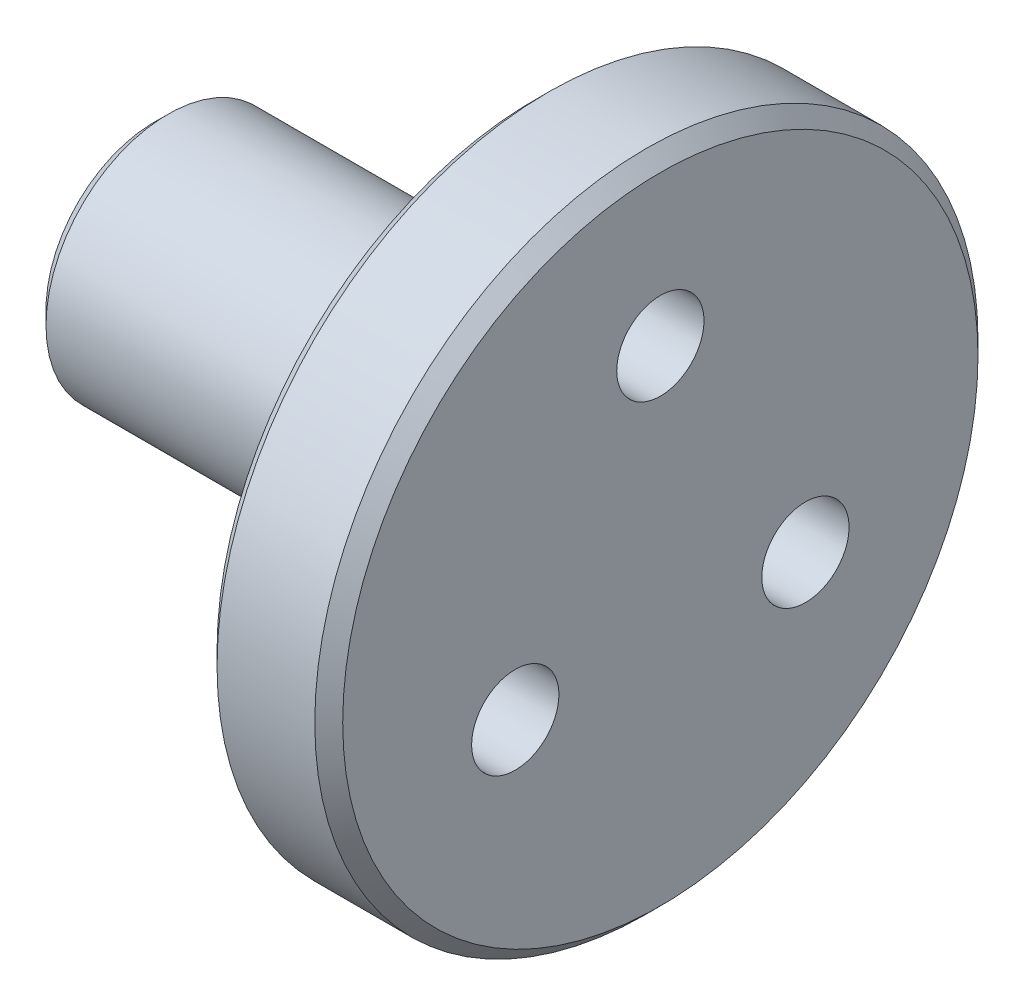
ISO-10303-21;
HEADER;
FILE_DESCRIPTION(('STEP AP214'),'2;1');
FILE_NAME('part.step','',(''),(''),'','','');
FILE_SCHEMA(('AUTOMOTIVE_DESIGN { 1 0 10303 214 1 1 1 1 }'));
ENDSEC;
DATA;
#1=APPLICATION_CONTEXT('core data for automotive mechanical design processes');
#2=APPLICATION_PROTOCOL_DEFINITION('international standard','automotive_design',2000,#1);
#3=PRODUCT_CONTEXT('',#1,'mechanical');
#4=PRODUCT('Part','Part','',(#3));
#5=PRODUCT_RELATED_PRODUCT_CATEGORY('part','',(#4));
#6=PRODUCT_DEFINITION_FORMATION('','',#4);
#7=PRODUCT_DEFINITION_CONTEXT('part definition',#1,'design');
#8=PRODUCT_DEFINITION('design','',#6,#7);
#9=PRODUCT_DEFINITION_SHAPE('','',#8);
#10=(LENGTH_UNIT() NAMED_UNIT(*) SI_UNIT(.MILLI.,.METRE.));
#11=(NAMED_UNIT(*) PLANE_ANGLE_UNIT() SI_UNIT($,.RADIAN.));
#12=(NAMED_UNIT(*) SI_UNIT($,.STERADIAN.) SOLID_ANGLE_UNIT());
#13=UNCERTAINTY_MEASURE_WITH_UNIT(LENGTH_MEASURE(1.E-05),#10,'distance_accuracy_value','');
#14=(GEOMETRIC_REPRESENTATION_CONTEXT(3) GLOBAL_UNCERTAINTY_ASSIGNED_CONTEXT((#13)) GLOBAL_UNIT_ASSIGNED_CONTEXT((#10,
#11,#12)) REPRESENTATION_CONTEXT('',''));
#15=CARTESIAN_POINT('',(0.,0.,0.));
#16=DIRECTION('',(0.,0.,1.));
#17=DIRECTION('',(1.,0.,0.));
#18=AXIS2_PLACEMENT_3D('',#15,#16,#17);
#19=CARTESIAN_POINT('',(0.,0.,0.));
#20=DIRECTION('',(-1.,0.,0.));
#21=DIRECTION('',(0.,0.,1.));
#22=AXIS2_PLACEMENT_3D('',#19,#20,#21);
#23=PLANE('',#22);
#24=CARTESIAN_POINT('',(0.,-2.40000000000002,-4.15692193816529));
#25=DIRECTION('',(-1.,0.,0.));
#26=DIRECTION('',(0.,0.866025403784436,-0.500000000000004));
#27=AXIS2_PLACEMENT_3D('',#24,#25,#26);
#28=CIRCLE('',#27,1.25);
#29=CARTESIAN_POINT('',(0.,-2.40000000000002,-2.90692193816529));
#30=VERTEX_POINT('',#29);
#31=EDGE_CURVE('E68',#30,#30,#28,.T.);
#32=ORIENTED_EDGE('',*,*,#31,.T.);
#33=EDGE_LOOP('',(#32));
#34=FACE_BOUND('',#33,.T.);
#35=CARTESIAN_POINT('',(0.,-2.39999999999996,4.15692193816533));
#36=DIRECTION('',(-1.,0.,0.));
#37=DIRECTION('',(0.,-0.866025403784443,-0.499999999999992));
#38=AXIS2_PLACEMENT_3D('',#35,#36,#37);
#39=CIRCLE('',#38,1.25);
#40=CARTESIAN_POINT('',(0.,-2.39999999999996,5.40692193816533));
#41=VERTEX_POINT('',#40);
#42=EDGE_CURVE('E74',#41,#41,#39,.T.);
#43=ORIENTED_EDGE('',*,*,#42,.T.);
#44=EDGE_LOOP('',(#43));
#45=FACE_BOUND('',#44,.T.);
#46=CARTESIAN_POINT('',(0.,0.,0.));
#47=DIRECTION('',(-1.,0.,0.));
#48=DIRECTION('',(0.,0.,1.));
#49=AXIS2_PLACEMENT_3D('',#46,#47,#48);
#50=CIRCLE('',#49,9.1);
#51=CARTESIAN_POINT('',(0.,0.,9.1));
#52=VERTEX_POINT('',#51);
#53=EDGE_CURVE('E42',#52,#52,#50,.F.);
#54=ORIENTED_EDGE('',*,*,#53,.T.);
#55=EDGE_LOOP('',(#54));
#56=FACE_BOUND('',#55,.T.);
#57=CARTESIAN_POINT('',(0.,4.8,0.));
#58=DIRECTION('',(-1.,0.,0.));
#59=DIRECTION('',(0.,0.,1.));
#60=AXIS2_PLACEMENT_3D('',#57,#58,#59);
#61=CIRCLE('',#60,1.25);
#62=CARTESIAN_POINT('',(0.,4.8,1.25));
#63=VERTEX_POINT('',#62);
#64=EDGE_CURVE('E64',#63,#63,#61,.T.);
#65=ORIENTED_EDGE('',*,*,#64,.T.);
#66=EDGE_LOOP('',(#65));
#67=FACE_BOUND('',#66,.T.);
#68=ADVANCED_FACE('F34',(#34,#45,#56,#67),#23,.F.);
#69=CARTESIAN_POINT('',(-14.5,0.,0.));
#70=DIRECTION('',(-1.,0.,0.));
#71=DIRECTION('',(0.,0.,1.));
#72=AXIS2_PLACEMENT_3D('',#69,#70,#71);
#73=CYLINDRICAL_SURFACE('',#72,9.5);
#74=CARTESIAN_POINT('',(-0.399999999999998,0.,0.));
#75=DIRECTION('',(-1.,0.,0.));
#76=DIRECTION('',(0.,0.,1.));
#77=AXIS2_PLACEMENT_3D('',#74,#75,#76);
#78=CIRCLE('',#77,9.5);
#79=CARTESIAN_POINT('',(-0.399999999999998,0.,9.5));
#80=VERTEX_POINT('',#79);
#81=EDGE_CURVE('E46',#80,#80,#78,.T.);
#82=ORIENTED_EDGE('',*,*,#81,.T.);
#83=EDGE_LOOP('',(#82));
#84=FACE_BOUND('',#83,.T.);
#85=CARTESIAN_POINT('',(-3.2,0.,0.));
#86=DIRECTION('',(1.,0.,0.));
#87=DIRECTION('',(0.,0.,-1.));
#88=AXIS2_PLACEMENT_3D('',#85,#86,#87);
#89=CIRCLE('',#88,9.5);
#90=CARTESIAN_POINT('',(-3.2,0.,-9.5));
#91=VERTEX_POINT('',#90);
#92=EDGE_CURVE('E50',#91,#91,#89,.T.);
#93=ORIENTED_EDGE('',*,*,#92,.T.);
#94=EDGE_LOOP('',(#93));
#95=FACE_BOUND('',#94,.T.);
#96=ADVANCED_FACE('F96',(#84,#95),#73,.T.);
#97=CARTESIAN_POINT('',(-3.6,9.5,0.));
#98=DIRECTION('',(1.,0.,0.));
#99=DIRECTION('',(0.,0.,-1.));
#100=AXIS2_PLACEMENT_3D('',#97,#98,#99);
#101=PLANE('',#100);
#102=CARTESIAN_POINT('',(-3.6,-2.40000000000002,-4.15692193816529));
#103=DIRECTION('',(-1.,0.,0.));
#104=DIRECTION('',(0.,0.866025403784436,-0.500000000000004));
#105=AXIS2_PLACEMENT_3D('',#102,#103,#104);
#106=CIRCLE('',#105,1.25);
#107=CARTESIAN_POINT('',(-3.6,-2.40000000000002,-2.90692193816529));
#108=VERTEX_POINT('',#107);
#109=EDGE_CURVE('E77',#108,#108,#106,.T.);
#110=ORIENTED_EDGE('',*,*,#109,.F.);
#111=EDGE_LOOP('',(#110));
#112=FACE_BOUND('',#111,.T.);
#113=CARTESIAN_POINT('',(-3.6,-2.39999999999996,4.15692193816533));
#114=DIRECTION('',(-1.,0.,0.));
#115=DIRECTION('',(0.,-0.866025403784443,-0.499999999999992));
#116=AXIS2_PLACEMENT_3D('',#113,#114,#115);
#117=CIRCLE('',#116,1.25);
#118=CARTESIAN_POINT('',(-3.6,-2.39999999999996,5.40692193816533));
#119=VERTEX_POINT('',#118);
#120=EDGE_CURVE('E71',#119,#119,#117,.T.);
#121=ORIENTED_EDGE('',*,*,#120,.F.);
#122=EDGE_LOOP('',(#121));
#123=FACE_BOUND('',#122,.T.);
#124=CARTESIAN_POINT('',(-3.6,0.,0.));
#125=DIRECTION('',(1.,0.,0.));
#126=DIRECTION('',(0.,0.,-1.));
#127=AXIS2_PLACEMENT_3D('',#124,#125,#126);
#128=CIRCLE('',#127,9.1);
#129=CARTESIAN_POINT('',(-3.6,0.,-9.1));
#130=VERTEX_POINT('',#129);
#131=EDGE_CURVE('E10',#130,#130,#128,.F.);
#132=ORIENTED_EDGE('',*,*,#131,.T.);
#133=EDGE_LOOP('',(#132));
#134=FACE_BOUND('',#133,.T.);
#135=CARTESIAN_POINT('',(-3.6,4.8,0.));
#136=DIRECTION('',(-1.,0.,0.));
#137=DIRECTION('',(0.,0.,1.));
#138=AXIS2_PLACEMENT_3D('',#135,#136,#137);
#139=CIRCLE('',#138,1.25);
#140=CARTESIAN_POINT('',(-3.6,4.8,1.25));
#141=VERTEX_POINT('',#140);
#142=EDGE_CURVE('E65',#141,#141,#139,.T.);
#143=ORIENTED_EDGE('',*,*,#142,.F.);
#144=EDGE_LOOP('',(#143));
#145=FACE_BOUND('',#144,.T.);
#146=CARTESIAN_POINT('',(-3.6,0.,0.));
#147=DIRECTION('',(-1.,0.,0.));
#148=DIRECTION('',(0.,0.,1.));
#149=AXIS2_PLACEMENT_3D('',#146,#147,#148);
#150=CIRCLE('',#149,3.5);
#151=CARTESIAN_POINT('',(-3.6,0.,3.5));
#152=VERTEX_POINT('',#151);
#153=EDGE_CURVE('E61',#152,#152,#150,.T.);
#154=ORIENTED_EDGE('',*,*,#153,.F.);
#155=EDGE_LOOP('',(#154));
#156=FACE_BOUND('',#155,.T.);
#157=ADVANCED_FACE('F92',(#112,#123,#134,#145,#156),#101,.F.);
#158=CARTESIAN_POINT('',(-14.5,0.,0.));
#159=DIRECTION('',(-1.,0.,0.));
#160=DIRECTION('',(0.,0.,1.));
#161=AXIS2_PLACEMENT_3D('',#158,#159,#160);
#162=CYLINDRICAL_SURFACE('',#161,3.5);
#163=CARTESIAN_POINT('',(-14.1,0.,0.));
#164=DIRECTION('',(1.,0.,0.));
#165=DIRECTION('',(0.,0.,-1.));
#166=AXIS2_PLACEMENT_3D('',#163,#164,#165);
#167=CIRCLE('',#166,3.5);
#168=CARTESIAN_POINT('',(-14.1,0.,-3.5));
#169=VERTEX_POINT('',#168);
#170=EDGE_CURVE('E55',#169,#169,#167,.T.);
#171=ORIENTED_EDGE('',*,*,#170,.T.);
#172=EDGE_LOOP('',(#171));
#173=FACE_BOUND('',#172,.T.);
#174=ORIENTED_EDGE('',*,*,#153,.T.);
#175=EDGE_LOOP('',(#174));
#176=FACE_BOUND('',#175,.T.);
#177=ADVANCED_FACE('F95',(#173,#176),#162,.T.);
#178=CARTESIAN_POINT('',(-14.5,3.5,0.));
#179=DIRECTION('',(1.,0.,0.));
#180=DIRECTION('',(0.,0.,-1.));
#181=AXIS2_PLACEMENT_3D('',#178,#179,#180);
#182=PLANE('',#181);
#183=CARTESIAN_POINT('',(-14.5,0.,0.));
#184=DIRECTION('',(1.,0.,0.));
#185=DIRECTION('',(0.,0.,-1.));
#186=AXIS2_PLACEMENT_3D('',#183,#184,#185);
#187=CIRCLE('',#186,3.1);
#188=CARTESIAN_POINT('',(-14.5,0.,-3.1));
#189=VERTEX_POINT('',#188);
#190=EDGE_CURVE('E58',#189,#189,#187,.F.);
#191=ORIENTED_EDGE('',*,*,#190,.T.);
#192=EDGE_LOOP('',(#191));
#193=FACE_BOUND('',#192,.T.);
#194=ADVANCED_FACE('F105',(#193),#182,.F.);
#195=CARTESIAN_POINT('',(0.,4.8,0.));
#196=DIRECTION('',(-1.,0.,0.));
#197=DIRECTION('',(0.,0.,1.));
#198=AXIS2_PLACEMENT_3D('',#195,#196,#197);
#199=CYLINDRICAL_SURFACE('',#198,1.25);
#200=CARTESIAN_POINT('',(0.,4.8,1.25));
#201=CARTESIAN_POINT('',(-0.0374999999999999,4.8,1.25));
#202=CARTESIAN_POINT('',(-0.075,4.8,1.25));
#203=CARTESIAN_POINT('',(-0.15,4.8,1.25));
#204=CARTESIAN_POINT('',(-0.1875,4.8,1.25));
#205=CARTESIAN_POINT('',(-0.2625,4.8,1.25));
#206=CARTESIAN_POINT('',(-0.3,4.8,1.25));
#207=CARTESIAN_POINT('',(-0.375,4.8,1.25));
#208=CARTESIAN_POINT('',(-0.4125,4.8,1.25));
#209=CARTESIAN_POINT('',(-0.4875,4.8,1.25));
#210=CARTESIAN_POINT('',(-0.525,4.8,1.25));
#211=CARTESIAN_POINT('',(-0.6,4.8,1.25));
#212=CARTESIAN_POINT('',(-0.6375,4.8,1.25));
#213=CARTESIAN_POINT('',(-0.7125,4.8,1.25));
#214=CARTESIAN_POINT('',(-0.75,4.8,1.25));
#215=CARTESIAN_POINT('',(-0.825,4.8,1.25));
#216=CARTESIAN_POINT('',(-0.8625,4.8,1.25));
#217=CARTESIAN_POINT('',(-0.9375,4.8,1.25));
#218=CARTESIAN_POINT('',(-0.975,4.8,1.25));
#219=CARTESIAN_POINT('',(-1.05,4.8,1.25));
#220=CARTESIAN_POINT('',(-1.0875,4.8,1.25));
#221=CARTESIAN_POINT('',(-1.1625,4.8,1.25));
#222=CARTESIAN_POINT('',(-1.2,4.8,1.25));
#223=CARTESIAN_POINT('',(-1.275,4.8,1.25));
#224=CARTESIAN_POINT('',(-1.3125,4.8,1.25));
#225=CARTESIAN_POINT('',(-1.3875,4.8,1.25));
#226=CARTESIAN_POINT('',(-1.425,4.8,1.25));
#227=CARTESIAN_POINT('',(-1.5,4.8,1.25));
#228=CARTESIAN_POINT('',(-1.5375,4.8,1.25));
#229=CARTESIAN_POINT('',(-1.6125,4.8,1.25));
#230=CARTESIAN_POINT('',(-1.65,4.8,1.25));
#231=CARTESIAN_POINT('',(-1.725,4.8,1.25));
#232=CARTESIAN_POINT('',(-1.7625,4.8,1.25));
#233=CARTESIAN_POINT('',(-1.8375,4.8,1.25));
#234=CARTESIAN_POINT('',(-1.875,4.8,1.25));
#235=CARTESIAN_POINT('',(-1.95,4.8,1.25));
#236=CARTESIAN_POINT('',(-1.9875,4.8,1.25));
#237=CARTESIAN_POINT('',(-2.0625,4.8,1.25));
#238=CARTESIAN_POINT('',(-2.1,4.8,1.25));
#239=CARTESIAN_POINT('',(-2.175,4.8,1.25));
#240=CARTESIAN_POINT('',(-2.2125,4.8,1.25));
#241=CARTESIAN_POINT('',(-2.2875,4.8,1.25));
#242=CARTESIAN_POINT('',(-2.325,4.8,1.25));
#243=CARTESIAN_POINT('',(-2.4,4.8,1.25));
#244=CARTESIAN_POINT('',(-2.4375,4.8,1.25));
#245=CARTESIAN_POINT('',(-2.5125,4.8,1.25));
#246=CARTESIAN_POINT('',(-2.55,4.8,1.25));
#247=CARTESIAN_POINT('',(-2.625,4.8,1.25));
#248=CARTESIAN_POINT('',(-2.6625,4.8,1.25));
#249=CARTESIAN_POINT('',(-2.7375,4.8,1.25));
#250=CARTESIAN_POINT('',(-2.775,4.8,1.25));
#251=CARTESIAN_POINT('',(-2.85,4.8,1.25));
#252=CARTESIAN_POINT('',(-2.8875,4.8,1.25));
#253=CARTESIAN_POINT('',(-2.9625,4.8,1.25));
#254=CARTESIAN_POINT('',(-3.,4.8,1.25));
#255=CARTESIAN_POINT('',(-3.075,4.8,1.25));
#256=CARTESIAN_POINT('',(-3.1125,4.8,1.25));
#257=CARTESIAN_POINT('',(-3.1875,4.8,1.25));
#258=CARTESIAN_POINT('',(-3.225,4.8,1.25));
#259=CARTESIAN_POINT('',(-3.3,4.8,1.25));
#260=CARTESIAN_POINT('',(-3.3375,4.8,1.25));
#261=CARTESIAN_POINT('',(-3.4125,4.8,1.25));
#262=CARTESIAN_POINT('',(-3.45,4.8,1.25));
#263=CARTESIAN_POINT('',(-3.525,4.8,1.25));
#264=CARTESIAN_POINT('',(-3.5625,4.8,1.25));
#265=CARTESIAN_POINT('',(-3.6,4.8,1.25));
#266=B_SPLINE_CURVE_WITH_KNOTS('',3,(#200,#201,#202,#203,#204,#205,#206,#207,#208,#209,#210,
#211,#212,#213,#214,#215,#216,#217,#218,#219,#220,#221,#222,#223,#224,#225,#226,#227,#228,#229,
#230,#231,#232,#233,#234,#235,#236,#237,#238,#239,#240,#241,#242,#243,#244,#245,#246,#247,#248,
#249,#250,#251,#252,#253,#254,#255,#256,#257,#258,#259,#260,#261,#262,#263,#264,#265),
.UNSPECIFIED.,.F.,.F.,(4,2,2,2,2,2,2,2,2,2,2,2,2,2,2,2,2,2,2,2,2,2,2,2,2,2,2,2,2,2,2,2,4),(0.,
0.1125,0.225,0.3375,0.45,0.5625,0.675,0.7875,0.9,1.0125,1.125,1.2375,1.35,1.4625,1.575,1.6875,
1.8,1.9125,2.025,2.1375,2.25,2.3625,2.475,2.5875,2.7,2.8125,2.925,3.0375,3.15,3.2625,3.375,
3.4875,3.6),.UNSPECIFIED.);
#267=EDGE_CURVE('BSEAM111',#63,#141,#266,.T.);
#268=ORIENTED_EDGE('',*,*,#64,.F.);
#269=ORIENTED_EDGE('',*,*,#142,.T.);
#270=ORIENTED_EDGE('',*,*,#267,.T.);
#271=ORIENTED_EDGE('',*,*,#267,.F.);
#272=EDGE_LOOP('',(#268,#270,#269,#271));
#273=FACE_BOUND('',#272,.T.);
#274=ADVANCED_FACE('F111',(#273),#199,.F.);
#275=CARTESIAN_POINT('',(-14.5,0.,0.));
#276=DIRECTION('',(1.,0.,0.));
#277=DIRECTION('',(0.,0.,-1.));
#278=AXIS2_PLACEMENT_3D('',#275,#276,#277);
#279=CONICAL_SURFACE('',#278,3.1,0.785398163397446);
#280=ORIENTED_EDGE('',*,*,#170,.F.);
#281=EDGE_LOOP('',(#280));
#282=FACE_BOUND('',#281,.T.);
#283=ORIENTED_EDGE('',*,*,#190,.F.);
#284=EDGE_LOOP('',(#283));
#285=FACE_BOUND('',#284,.T.);
#286=ADVANCED_FACE('F123',(#282,#285),#279,.T.);
#287=CARTESIAN_POINT('',(-0.399999999999998,0.,0.));
#288=DIRECTION('',(-1.,0.,0.));
#289=DIRECTION('',(0.,0.,1.));
#290=AXIS2_PLACEMENT_3D('',#287,#288,#289);
#291=CONICAL_SURFACE('',#290,9.5,0.785398163397453);
#292=ORIENTED_EDGE('',*,*,#53,.F.);
#293=EDGE_LOOP('',(#292));
#294=FACE_BOUND('',#293,.T.);
#295=ORIENTED_EDGE('',*,*,#81,.F.);
#296=EDGE_LOOP('',(#295));
#297=FACE_BOUND('',#296,.T.);
#298=ADVANCED_FACE('F128',(#294,#297),#291,.T.);
#299=CARTESIAN_POINT('',(-3.6,0.,0.));
#300=DIRECTION('',(1.,0.,0.));
#301=DIRECTION('',(0.,0.,-1.));
#302=AXIS2_PLACEMENT_3D('',#299,#300,#301);
#303=CONICAL_SURFACE('',#302,9.1,0.785398163397446);
#304=ORIENTED_EDGE('',*,*,#92,.F.);
#305=EDGE_LOOP('',(#304));
#306=FACE_BOUND('',#305,.T.);
#307=ORIENTED_EDGE('',*,*,#131,.F.);
#308=EDGE_LOOP('',(#307));
#309=FACE_BOUND('',#308,.T.);
#310=ADVANCED_FACE('F37',(#306,#309),#303,.T.);
#311=CARTESIAN_POINT('',(0.,-2.39999999999996,4.15692193816533));
#312=DIRECTION('',(-1.,0.,0.));
#313=DIRECTION('',(0.,0.,1.));
#314=AXIS2_PLACEMENT_3D('',#311,#312,#313);
#315=CYLINDRICAL_SURFACE('',#314,1.25);
#316=CARTESIAN_POINT('',(0.,-2.39999999999996,5.40692193816533));
#317=CARTESIAN_POINT('',(-0.0374999999999999,-2.39999999999996,5.40692193816533));
#318=CARTESIAN_POINT('',(-0.075,-2.39999999999996,5.40692193816533));
#319=CARTESIAN_POINT('',(-0.15,-2.39999999999996,5.40692193816533));
#320=CARTESIAN_POINT('',(-0.1875,-2.39999999999996,5.40692193816533));
#321=CARTESIAN_POINT('',(-0.2625,-2.39999999999996,5.40692193816533));
#322=CARTESIAN_POINT('',(-0.3,-2.39999999999996,5.40692193816533));
#323=CARTESIAN_POINT('',(-0.375,-2.39999999999996,5.40692193816533));
#324=CARTESIAN_POINT('',(-0.4125,-2.39999999999996,5.40692193816533));
#325=CARTESIAN_POINT('',(-0.4875,-2.39999999999996,5.40692193816533));
#326=CARTESIAN_POINT('',(-0.525,-2.39999999999996,5.40692193816533));
#327=CARTESIAN_POINT('',(-0.6,-2.39999999999996,5.40692193816533));
#328=CARTESIAN_POINT('',(-0.6375,-2.39999999999996,5.40692193816533));
#329=CARTESIAN_POINT('',(-0.7125,-2.39999999999996,5.40692193816533));
#330=CARTESIAN_POINT('',(-0.75,-2.39999999999996,5.40692193816533));
#331=CARTESIAN_POINT('',(-0.825,-2.39999999999996,5.40692193816533));
#332=CARTESIAN_POINT('',(-0.8625,-2.39999999999996,5.40692193816533));
#333=CARTESIAN_POINT('',(-0.9375,-2.39999999999996,5.40692193816533));
#334=CARTESIAN_POINT('',(-0.975,-2.39999999999996,5.40692193816533));
#335=CARTESIAN_POINT('',(-1.05,-2.39999999999996,5.40692193816533));
#336=CARTESIAN_POINT('',(-1.0875,-2.39999999999996,5.40692193816533));
#337=CARTESIAN_POINT('',(-1.1625,-2.39999999999996,5.40692193816533));
#338=CARTESIAN_POINT('',(-1.2,-2.39999999999996,5.40692193816533));
#339=CARTESIAN_POINT('',(-1.275,-2.39999999999996,5.40692193816533));
#340=CARTESIAN_POINT('',(-1.3125,-2.39999999999996,5.40692193816533));
#341=CARTESIAN_POINT('',(-1.3875,-2.39999999999996,5.40692193816533));
#342=CARTESIAN_POINT('',(-1.425,-2.39999999999996,5.40692193816533));
#343=CARTESIAN_POINT('',(-1.5,-2.39999999999996,5.40692193816533));
#344=CARTESIAN_POINT('',(-1.5375,-2.39999999999996,5.40692193816533));
#345=CARTESIAN_POINT('',(-1.6125,-2.39999999999996,5.40692193816533));
#346=CARTESIAN_POINT('',(-1.65,-2.39999999999996,5.40692193816533));
#347=CARTESIAN_POINT('',(-1.725,-2.39999999999996,5.40692193816533));
#348=CARTESIAN_POINT('',(-1.7625,-2.39999999999996,5.40692193816533));
#349=CARTESIAN_POINT('',(-1.8375,-2.39999999999996,5.40692193816533));
#350=CARTESIAN_POINT('',(-1.875,-2.39999999999996,5.40692193816533));
#351=CARTESIAN_POINT('',(-1.95,-2.39999999999996,5.40692193816533));
#352=CARTESIAN_POINT('',(-1.9875,-2.39999999999996,5.40692193816533));
#353=CARTESIAN_POINT('',(-2.0625,-2.39999999999996,5.40692193816533));
#354=CARTESIAN_POINT('',(-2.1,-2.39999999999996,5.40692193816533));
#355=CARTESIAN_POINT('',(-2.175,-2.39999999999996,5.40692193816533));
#356=CARTESIAN_POINT('',(-2.2125,-2.39999999999996,5.40692193816533));
#357=CARTESIAN_POINT('',(-2.2875,-2.39999999999996,5.40692193816533));
#358=CARTESIAN_POINT('',(-2.325,-2.39999999999996,5.40692193816533));
#359=CARTESIAN_POINT('',(-2.4,-2.39999999999996,5.40692193816533));
#360=CARTESIAN_POINT('',(-2.4375,-2.39999999999996,5.40692193816533));
#361=CARTESIAN_POINT('',(-2.5125,-2.39999999999996,5.40692193816533));
#362=CARTESIAN_POINT('',(-2.55,-2.39999999999996,5.40692193816533));
#363=CARTESIAN_POINT('',(-2.625,-2.39999999999996,5.40692193816533));
#364=CARTESIAN_POINT('',(-2.6625,-2.39999999999996,5.40692193816533));
#365=CARTESIAN_POINT('',(-2.7375,-2.39999999999996,5.40692193816533));
#366=CARTESIAN_POINT('',(-2.775,-2.39999999999996,5.40692193816533));
#367=CARTESIAN_POINT('',(-2.85,-2.39999999999996,5.40692193816533));
#368=CARTESIAN_POINT('',(-2.8875,-2.39999999999996,5.40692193816533));
#369=CARTESIAN_POINT('',(-2.9625,-2.39999999999996,5.40692193816533));
#370=CARTESIAN_POINT('',(-3.,-2.39999999999996,5.40692193816533));
#371=CARTESIAN_POINT('',(-3.075,-2.39999999999996,5.40692193816533));
#372=CARTESIAN_POINT('',(-3.1125,-2.39999999999996,5.40692193816533));
#373=CARTESIAN_POINT('',(-3.1875,-2.39999999999996,5.40692193816533));
#374=CARTESIAN_POINT('',(-3.225,-2.39999999999996,5.40692193816533));
#375=CARTESIAN_POINT('',(-3.3,-2.39999999999996,5.40692193816533));
#376=CARTESIAN_POINT('',(-3.3375,-2.39999999999996,5.40692193816533));
#377=CARTESIAN_POINT('',(-3.4125,-2.39999999999996,5.40692193816533));
#378=CARTESIAN_POINT('',(-3.45,-2.39999999999996,5.40692193816533));
#379=CARTESIAN_POINT('',(-3.525,-2.39999999999996,5.40692193816533));
#380=CARTESIAN_POINT('',(-3.5625,-2.39999999999996,5.40692193816533));
#381=CARTESIAN_POINT('',(-3.6,-2.39999999999996,5.40692193816533));
#382=B_SPLINE_CURVE_WITH_KNOTS('',3,(#316,#317,#318,#319,#320,#321,#322,#323,#324,#325,#326,
#327,#328,#329,#330,#331,#332,#333,#334,#335,#336,#337,#338,#339,#340,#341,#342,#343,#344,#345,
#346,#347,#348,#349,#350,#351,#352,#353,#354,#355,#356,#357,#358,#359,#360,#361,#362,#363,#364,
#365,#366,#367,#368,#369,#370,#371,#372,#373,#374,#375,#376,#377,#378,#379,#380,#381),
.UNSPECIFIED.,.F.,.F.,(4,2,2,2,2,2,2,2,2,2,2,2,2,2,2,2,2,2,2,2,2,2,2,2,2,2,2,2,2,2,2,2,4),(0.,
0.1125,0.225,0.3375,0.45,0.5625,0.675,0.7875,0.9,1.0125,1.125,1.2375,1.35,1.4625,1.575,1.6875,
1.8,1.9125,2.025,2.1375,2.25,2.3625,2.475,2.5875,2.7,2.8125,2.925,3.0375,3.15,3.2625,3.375,
3.4875,3.6),.UNSPECIFIED.);
#383=EDGE_CURVE('BSEAM88',#41,#119,#382,.T.);
#384=ORIENTED_EDGE('',*,*,#42,.F.);
#385=ORIENTED_EDGE('',*,*,#120,.T.);
#386=ORIENTED_EDGE('',*,*,#383,.T.);
#387=ORIENTED_EDGE('',*,*,#383,.F.);
#388=EDGE_LOOP('',(#384,#386,#385,#387));
#389=FACE_BOUND('',#388,.T.);
#390=ADVANCED_FACE('F88',(#389),#315,.F.);
#391=CARTESIAN_POINT('',(0.,-2.40000000000002,-4.15692193816529));
#392=DIRECTION('',(-1.,0.,0.));
#393=DIRECTION('',(0.,0.,1.));
#394=AXIS2_PLACEMENT_3D('',#391,#392,#393);
#395=CYLINDRICAL_SURFACE('',#394,1.25);
#396=CARTESIAN_POINT('',(0.,-2.40000000000002,-2.90692193816529));
#397=CARTESIAN_POINT('',(-0.0374999999999999,-2.40000000000002,-2.90692193816529));
#398=CARTESIAN_POINT('',(-0.075,-2.40000000000002,-2.90692193816529));
#399=CARTESIAN_POINT('',(-0.15,-2.40000000000002,-2.90692193816529));
#400=CARTESIAN_POINT('',(-0.1875,-2.40000000000002,-2.90692193816529));
#401=CARTESIAN_POINT('',(-0.2625,-2.40000000000002,-2.90692193816529));
#402=CARTESIAN_POINT('',(-0.3,-2.40000000000002,-2.90692193816529));
#403=CARTESIAN_POINT('',(-0.375,-2.40000000000002,-2.90692193816529));
#404=CARTESIAN_POINT('',(-0.4125,-2.40000000000002,-2.90692193816529));
#405=CARTESIAN_POINT('',(-0.4875,-2.40000000000002,-2.90692193816529));
#406=CARTESIAN_POINT('',(-0.525,-2.40000000000002,-2.90692193816529));
#407=CARTESIAN_POINT('',(-0.6,-2.40000000000002,-2.90692193816529));
#408=CARTESIAN_POINT('',(-0.6375,-2.40000000000002,-2.90692193816529));
#409=CARTESIAN_POINT('',(-0.7125,-2.40000000000002,-2.90692193816529));
#410=CARTESIAN_POINT('',(-0.75,-2.40000000000002,-2.90692193816529));
#411=CARTESIAN_POINT('',(-0.825,-2.40000000000002,-2.90692193816529));
#412=CARTESIAN_POINT('',(-0.8625,-2.40000000000002,-2.90692193816529));
#413=CARTESIAN_POINT('',(-0.9375,-2.40000000000002,-2.90692193816529));
#414=CARTESIAN_POINT('',(-0.975,-2.40000000000002,-2.90692193816529));
#415=CARTESIAN_POINT('',(-1.05,-2.40000000000002,-2.90692193816529));
#416=CARTESIAN_POINT('',(-1.0875,-2.40000000000002,-2.90692193816529));
#417=CARTESIAN_POINT('',(-1.1625,-2.40000000000002,-2.90692193816529));
#418=CARTESIAN_POINT('',(-1.2,-2.40000000000002,-2.90692193816529));
#419=CARTESIAN_POINT('',(-1.275,-2.40000000000002,-2.90692193816529));
#420=CARTESIAN_POINT('',(-1.3125,-2.40000000000002,-2.90692193816529));
#421=CARTESIAN_POINT('',(-1.3875,-2.40000000000002,-2.90692193816529));
#422=CARTESIAN_POINT('',(-1.425,-2.40000000000002,-2.90692193816529));
#423=CARTESIAN_POINT('',(-1.5,-2.40000000000002,-2.90692193816529));
#424=CARTESIAN_POINT('',(-1.5375,-2.40000000000002,-2.90692193816529));
#425=CARTESIAN_POINT('',(-1.6125,-2.40000000000002,-2.90692193816529));
#426=CARTESIAN_POINT('',(-1.65,-2.40000000000002,-2.90692193816529));
#427=CARTESIAN_POINT('',(-1.725,-2.40000000000002,-2.90692193816529));
#428=CARTESIAN_POINT('',(-1.7625,-2.40000000000002,-2.90692193816529));
#429=CARTESIAN_POINT('',(-1.8375,-2.40000000000002,-2.90692193816529));
#430=CARTESIAN_POINT('',(-1.875,-2.40000000000002,-2.90692193816529));
#431=CARTESIAN_POINT('',(-1.95,-2.40000000000002,-2.90692193816529));
#432=CARTESIAN_POINT('',(-1.9875,-2.40000000000002,-2.90692193816529));
#433=CARTESIAN_POINT('',(-2.0625,-2.40000000000002,-2.90692193816529));
#434=CARTESIAN_POINT('',(-2.1,-2.40000000000002,-2.90692193816529));
#435=CARTESIAN_POINT('',(-2.175,-2.40000000000002,-2.90692193816529));
#436=CARTESIAN_POINT('',(-2.2125,-2.40000000000002,-2.90692193816529));
#437=CARTESIAN_POINT('',(-2.2875,-2.40000000000002,-2.90692193816529));
#438=CARTESIAN_POINT('',(-2.325,-2.40000000000002,-2.90692193816529));
#439=CARTESIAN_POINT('',(-2.4,-2.40000000000002,-2.90692193816529));
#440=CARTESIAN_POINT('',(-2.4375,-2.40000000000002,-2.90692193816529));
#441=CARTESIAN_POINT('',(-2.5125,-2.40000000000002,-2.90692193816529));
#442=CARTESIAN_POINT('',(-2.55,-2.40000000000002,-2.90692193816529));
#443=CARTESIAN_POINT('',(-2.625,-2.40000000000002,-2.90692193816529));
#444=CARTESIAN_POINT('',(-2.6625,-2.40000000000002,-2.90692193816529));
#445=CARTESIAN_POINT('',(-2.7375,-2.40000000000002,-2.90692193816529));
#446=CARTESIAN_POINT('',(-2.775,-2.40000000000002,-2.90692193816529));
#447=CARTESIAN_POINT('',(-2.85,-2.40000000000002,-2.90692193816529));
#448=CARTESIAN_POINT('',(-2.8875,-2.40000000000002,-2.90692193816529));
#449=CARTESIAN_POINT('',(-2.9625,-2.40000000000002,-2.90692193816529));
#450=CARTESIAN_POINT('',(-3.,-2.40000000000002,-2.90692193816529));
#451=CARTESIAN_POINT('',(-3.075,-2.40000000000002,-2.90692193816529));
#452=CARTESIAN_POINT('',(-3.1125,-2.40000000000002,-2.90692193816529));
#453=CARTESIAN_POINT('',(-3.1875,-2.40000000000002,-2.90692193816529));
#454=CARTESIAN_POINT('',(-3.225,-2.40000000000002,-2.90692193816529));
#455=CARTESIAN_POINT('',(-3.3,-2.40000000000002,-2.90692193816529));
#456=CARTESIAN_POINT('',(-3.3375,-2.40000000000002,-2.90692193816529));
#457=CARTESIAN_POINT('',(-3.4125,-2.40000000000002,-2.90692193816529));
#458=CARTESIAN_POINT('',(-3.45,-2.40000000000002,-2.90692193816529));
#459=CARTESIAN_POINT('',(-3.525,-2.40000000000002,-2.90692193816529));
#460=CARTESIAN_POINT('',(-3.5625,-2.40000000000002,-2.90692193816529));
#461=CARTESIAN_POINT('',(-3.6,-2.40000000000002,-2.90692193816529));
#462=B_SPLINE_CURVE_WITH_KNOTS('',3,(#396,#397,#398,#399,#400,#401,#402,#403,#404,#405,#406,
#407,#408,#409,#410,#411,#412,#413,#414,#415,#416,#417,#418,#419,#420,#421,#422,#423,#424,#425,
#426,#427,#428,#429,#430,#431,#432,#433,#434,#435,#436,#437,#438,#439,#440,#441,#442,#443,#444,
#445,#446,#447,#448,#449,#450,#451,#452,#453,#454,#455,#456,#457,#458,#459,#460,#461),
.UNSPECIFIED.,.F.,.F.,(4,2,2,2,2,2,2,2,2,2,2,2,2,2,2,2,2,2,2,2,2,2,2,2,2,2,2,2,2,2,2,2,4),(0.,
0.1125,0.225,0.3375,0.45,0.5625,0.675,0.7875,0.9,1.0125,1.125,1.2375,1.35,1.4625,1.575,1.6875,
1.8,1.9125,2.025,2.1375,2.25,2.3625,2.475,2.5875,2.7,2.8125,2.925,3.0375,3.15,3.2625,3.375,
3.4875,3.6),.UNSPECIFIED.);
#463=EDGE_CURVE('BSEAM85',#30,#108,#462,.T.);
#464=ORIENTED_EDGE('',*,*,#31,.F.);
#465=ORIENTED_EDGE('',*,*,#109,.T.);
#466=ORIENTED_EDGE('',*,*,#463,.T.);
#467=ORIENTED_EDGE('',*,*,#463,.F.);
#468=EDGE_LOOP('',(#464,#466,#465,#467));
#469=FACE_BOUND('',#468,.T.);
#470=ADVANCED_FACE('F85',(#469),#395,.F.);
#471=CLOSED_SHELL('',(#68,#96,#157,#177,#194,#274,#286,#298,#310,#390,#470));
#472=MANIFOLD_SOLID_BREP('B2',#471);
#473=ADVANCED_BREP_SHAPE_REPRESENTATION('',(#18,#472),#14);
#474=SHAPE_DEFINITION_REPRESENTATION(#9,#473);
ENDSEC;
END-ISO-10303-21;
